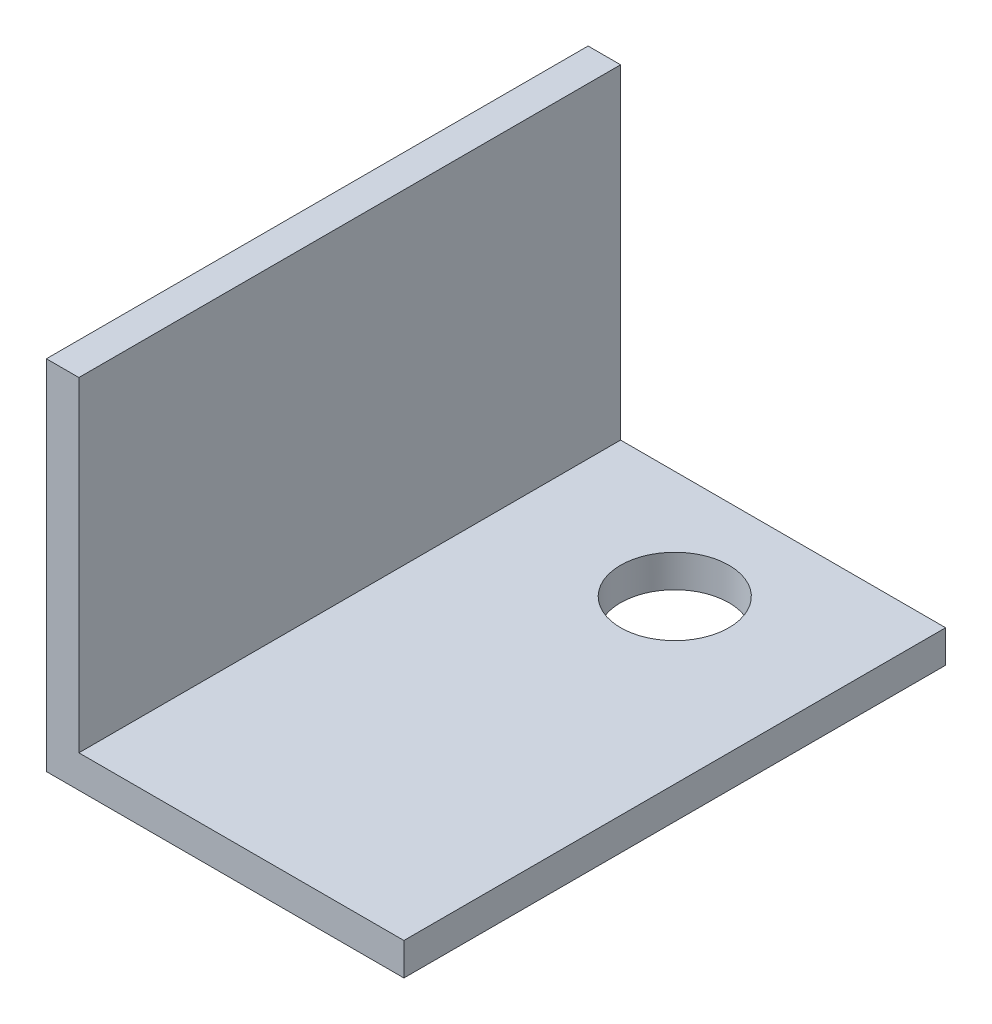
ISO-10303-21;
HEADER;
FILE_DESCRIPTION(('STEP AP214'),'2;1');
FILE_NAME('part.step','',(''),(''),'','','');
FILE_SCHEMA(('AUTOMOTIVE_DESIGN { 1 0 10303 214 1 1 1 1 }'));
ENDSEC;
DATA;
#1=APPLICATION_CONTEXT('core data for automotive mechanical design processes');
#2=APPLICATION_PROTOCOL_DEFINITION('international standard','automotive_design',2000,#1);
#3=PRODUCT_CONTEXT('',#1,'mechanical');
#4=PRODUCT('Part','Part','',(#3));
#5=PRODUCT_RELATED_PRODUCT_CATEGORY('part','',(#4));
#6=PRODUCT_DEFINITION_FORMATION('','',#4);
#7=PRODUCT_DEFINITION_CONTEXT('part definition',#1,'design');
#8=PRODUCT_DEFINITION('design','',#6,#7);
#9=PRODUCT_DEFINITION_SHAPE('','',#8);
#10=(LENGTH_UNIT() NAMED_UNIT(*) SI_UNIT(.MILLI.,.METRE.));
#11=(NAMED_UNIT(*) PLANE_ANGLE_UNIT() SI_UNIT($,.RADIAN.));
#12=(NAMED_UNIT(*) SI_UNIT($,.STERADIAN.) SOLID_ANGLE_UNIT());
#13=UNCERTAINTY_MEASURE_WITH_UNIT(LENGTH_MEASURE(1.E-05),#10,'distance_accuracy_value','');
#14=(GEOMETRIC_REPRESENTATION_CONTEXT(3) GLOBAL_UNCERTAINTY_ASSIGNED_CONTEXT((#13)) GLOBAL_UNIT_ASSIGNED_CONTEXT((#10,
#11,#12)) REPRESENTATION_CONTEXT('',''));
#15=CARTESIAN_POINT('',(0.,0.,0.));
#16=DIRECTION('',(0.,0.,1.));
#17=DIRECTION('',(1.,0.,0.));
#18=AXIS2_PLACEMENT_3D('',#15,#16,#17);
#19=CARTESIAN_POINT('',(0.,-3.,-50.));
#20=DIRECTION('',(0.,-1.,0.));
#21=DIRECTION('',(0.,0.,-1.));
#22=AXIS2_PLACEMENT_3D('',#19,#20,#21);
#23=PLANE('',#22);
#24=CARTESIAN_POINT('',(15.,-3.,-40.));
#25=DIRECTION('',(0.,1.,0.));
#26=DIRECTION('',(0.,0.,1.));
#27=AXIS2_PLACEMENT_3D('',#24,#25,#26);
#28=CIRCLE('',#27,5.);
#29=CARTESIAN_POINT('',(15.,-3.,-35.));
#30=VERTEX_POINT('',#29);
#31=EDGE_CURVE('E175',#30,#30,#28,.T.);
#32=ORIENTED_EDGE('',*,*,#31,.T.);
#33=EDGE_LOOP('',(#32));
#34=FACE_BOUND('',#33,.T.);
#35=DIRECTION('',(1.,0.,0.));
#36=VECTOR('',#35,1.);
#37=CARTESIAN_POINT('',(0.,-3.,0.));
#38=LINE('',#37,#36);
#39=CARTESIAN_POINT('',(-3.,-3.,0.));
#40=VERTEX_POINT('',#39);
#41=CARTESIAN_POINT('',(30.,-3.,0.));
#42=VERTEX_POINT('',#41);
#43=EDGE_CURVE('E116',#40,#42,#38,.T.);
#44=ORIENTED_EDGE('',*,*,#43,.F.);
#45=DIRECTION('',(0.,0.,1.));
#46=VECTOR('',#45,1.);
#47=CARTESIAN_POINT('',(-3.,-3.,-50.));
#48=LINE('',#47,#46);
#49=CARTESIAN_POINT('',(-3.,-3.,-50.));
#50=VERTEX_POINT('',#49);
#51=EDGE_CURVE('E11',#50,#40,#48,.T.);
#52=ORIENTED_EDGE('',*,*,#51,.F.);
#53=DIRECTION('',(1.,0.,0.));
#54=VECTOR('',#53,1.);
#55=CARTESIAN_POINT('',(0.,-3.,-50.));
#56=LINE('',#55,#54);
#57=CARTESIAN_POINT('',(30.,-3.,-50.));
#58=VERTEX_POINT('',#57);
#59=EDGE_CURVE('E129',#50,#58,#56,.T.);
#60=ORIENTED_EDGE('',*,*,#59,.T.);
#61=DIRECTION('',(0.,0.,1.));
#62=VECTOR('',#61,1.);
#63=CARTESIAN_POINT('',(30.,-3.,-50.));
#64=LINE('',#63,#62);
#65=EDGE_CURVE('E115',#58,#42,#64,.T.);
#66=ORIENTED_EDGE('',*,*,#65,.T.);
#67=EDGE_LOOP('',(#44,#52,#60,#66));
#68=FACE_BOUND('',#67,.T.);
#69=ADVANCED_FACE('F33',(#34,#68),#23,.T.);
#70=CARTESIAN_POINT('',(-3.,30.,-50.));
#71=DIRECTION('',(-1.,0.,0.));
#72=DIRECTION('',(0.,-1.,0.));
#73=AXIS2_PLACEMENT_3D('',#70,#71,#72);
#74=PLANE('',#73);
#75=DIRECTION('',(0.,-1.,0.));
#76=VECTOR('',#75,1.);
#77=CARTESIAN_POINT('',(-3.,30.,0.));
#78=LINE('',#77,#76);
#79=CARTESIAN_POINT('',(-3.,30.,0.));
#80=VERTEX_POINT('',#79);
#81=EDGE_CURVE('E127',#80,#40,#78,.T.);
#82=ORIENTED_EDGE('',*,*,#81,.F.);
#83=DIRECTION('',(0.,0.,1.));
#84=VECTOR('',#83,1.);
#85=CARTESIAN_POINT('',(-3.,30.,-50.));
#86=LINE('',#85,#84);
#87=CARTESIAN_POINT('',(-3.,30.,-50.));
#88=VERTEX_POINT('',#87);
#89=EDGE_CURVE('E42',#88,#80,#86,.T.);
#90=ORIENTED_EDGE('',*,*,#89,.F.);
#91=DIRECTION('',(0.,-1.,0.));
#92=VECTOR('',#91,1.);
#93=CARTESIAN_POINT('',(-3.,30.,-50.));
#94=LINE('',#93,#92);
#95=EDGE_CURVE('E96',#88,#50,#94,.T.);
#96=ORIENTED_EDGE('',*,*,#95,.T.);
#97=ORIENTED_EDGE('',*,*,#51,.T.);
#98=EDGE_LOOP('',(#82,#90,#96,#97));
#99=FACE_BOUND('',#98,.T.);
#100=ADVANCED_FACE('F142',(#99),#74,.T.);
#101=CARTESIAN_POINT('',(-3.,30.,-50.));
#102=DIRECTION('',(0.,-1.,0.));
#103=DIRECTION('',(0.,0.,-1.));
#104=AXIS2_PLACEMENT_3D('',#101,#102,#103);
#105=PLANE('',#104);
#106=DIRECTION('',(1.,0.,0.));
#107=VECTOR('',#106,1.);
#108=CARTESIAN_POINT('',(-3.,30.,0.));
#109=LINE('',#108,#107);
#110=CARTESIAN_POINT('',(0.,30.,0.));
#111=VERTEX_POINT('',#110);
#112=EDGE_CURVE('E101',#80,#111,#109,.T.);
#113=ORIENTED_EDGE('',*,*,#112,.T.);
#114=DIRECTION('',(0.,0.,1.));
#115=VECTOR('',#114,1.);
#116=CARTESIAN_POINT('',(0.,30.,-50.));
#117=LINE('',#116,#115);
#118=CARTESIAN_POINT('',(0.,30.,-50.));
#119=VERTEX_POINT('',#118);
#120=EDGE_CURVE('E99',#119,#111,#117,.T.);
#121=ORIENTED_EDGE('',*,*,#120,.F.);
#122=DIRECTION('',(1.,0.,0.));
#123=VECTOR('',#122,1.);
#124=CARTESIAN_POINT('',(-3.,30.,-50.));
#125=LINE('',#124,#123);
#126=EDGE_CURVE('E90',#88,#119,#125,.T.);
#127=ORIENTED_EDGE('',*,*,#126,.F.);
#128=ORIENTED_EDGE('',*,*,#89,.T.);
#129=EDGE_LOOP('',(#113,#121,#127,#128));
#130=FACE_BOUND('',#129,.T.);
#131=ADVANCED_FACE('F100',(#130),#105,.F.);
#132=CARTESIAN_POINT('',(0.,30.,-50.));
#133=DIRECTION('',(-1.,0.,0.));
#134=DIRECTION('',(0.,-1.,0.));
#135=AXIS2_PLACEMENT_3D('',#132,#133,#134);
#136=PLANE('',#135);
#137=DIRECTION('',(0.,-1.,0.));
#138=VECTOR('',#137,1.);
#139=CARTESIAN_POINT('',(0.,30.,0.));
#140=LINE('',#139,#138);
#141=CARTESIAN_POINT('',(0.,0.,0.));
#142=VERTEX_POINT('',#141);
#143=EDGE_CURVE('E124',#111,#142,#140,.T.);
#144=ORIENTED_EDGE('',*,*,#143,.T.);
#145=DIRECTION('',(0.,0.,1.));
#146=VECTOR('',#145,1.);
#147=CARTESIAN_POINT('',(0.,0.,-50.));
#148=LINE('',#147,#146);
#149=CARTESIAN_POINT('',(0.,0.,-50.));
#150=VERTEX_POINT('',#149);
#151=EDGE_CURVE('E104',#150,#142,#148,.T.);
#152=ORIENTED_EDGE('',*,*,#151,.F.);
#153=DIRECTION('',(0.,-1.,0.));
#154=VECTOR('',#153,1.);
#155=CARTESIAN_POINT('',(0.,30.,-50.));
#156=LINE('',#155,#154);
#157=EDGE_CURVE('E94',#119,#150,#156,.T.);
#158=ORIENTED_EDGE('',*,*,#157,.F.);
#159=ORIENTED_EDGE('',*,*,#120,.T.);
#160=EDGE_LOOP('',(#144,#152,#158,#159));
#161=FACE_BOUND('',#160,.T.);
#162=ADVANCED_FACE('F106',(#161),#136,.F.);
#163=CARTESIAN_POINT('',(0.,0.,-50.));
#164=DIRECTION('',(0.,-1.,0.));
#165=DIRECTION('',(0.,0.,-1.));
#166=AXIS2_PLACEMENT_3D('',#163,#164,#165);
#167=PLANE('',#166);
#168=CARTESIAN_POINT('',(15.,0.,-40.));
#169=DIRECTION('',(0.,-1.,0.));
#170=DIRECTION('',(0.,0.,-1.));
#171=AXIS2_PLACEMENT_3D('',#168,#169,#170);
#172=CIRCLE('',#171,5.);
#173=CARTESIAN_POINT('',(15.,0.,-45.));
#174=VERTEX_POINT('',#173);
#175=EDGE_CURVE('E36',#174,#174,#172,.F.);
#176=ORIENTED_EDGE('',*,*,#175,.F.);
#177=EDGE_LOOP('',(#176));
#178=FACE_BOUND('',#177,.T.);
#179=DIRECTION('',(1.,0.,0.));
#180=VECTOR('',#179,1.);
#181=CARTESIAN_POINT('',(0.,0.,0.));
#182=LINE('',#181,#180);
#183=CARTESIAN_POINT('',(30.,0.,0.));
#184=VERTEX_POINT('',#183);
#185=EDGE_CURVE('E122',#142,#184,#182,.T.);
#186=ORIENTED_EDGE('',*,*,#185,.T.);
#187=DIRECTION('',(0.,0.,1.));
#188=VECTOR('',#187,1.);
#189=CARTESIAN_POINT('',(30.,0.,-50.));
#190=LINE('',#189,#188);
#191=CARTESIAN_POINT('',(30.,0.,-50.));
#192=VERTEX_POINT('',#191);
#193=EDGE_CURVE('E133',#192,#184,#190,.T.);
#194=ORIENTED_EDGE('',*,*,#193,.F.);
#195=DIRECTION('',(1.,0.,0.));
#196=VECTOR('',#195,1.);
#197=CARTESIAN_POINT('',(0.,0.,-50.));
#198=LINE('',#197,#196);
#199=EDGE_CURVE('E109',#150,#192,#198,.T.);
#200=ORIENTED_EDGE('',*,*,#199,.F.);
#201=ORIENTED_EDGE('',*,*,#151,.T.);
#202=EDGE_LOOP('',(#186,#194,#200,#201));
#203=FACE_BOUND('',#202,.T.);
#204=ADVANCED_FACE('F156',(#178,#203),#167,.F.);
#205=CARTESIAN_POINT('',(30.,0.,-50.));
#206=DIRECTION('',(-1.,0.,0.));
#207=DIRECTION('',(0.,0.,1.));
#208=AXIS2_PLACEMENT_3D('',#205,#206,#207);
#209=PLANE('',#208);
#210=DIRECTION('',(0.,-1.,0.));
#211=VECTOR('',#210,1.);
#212=CARTESIAN_POINT('',(30.,0.,0.));
#213=LINE('',#212,#211);
#214=EDGE_CURVE('E119',#184,#42,#213,.T.);
#215=ORIENTED_EDGE('',*,*,#214,.T.);
#216=ORIENTED_EDGE('',*,*,#65,.F.);
#217=DIRECTION('',(0.,-1.,0.));
#218=VECTOR('',#217,1.);
#219=CARTESIAN_POINT('',(30.,0.,-50.));
#220=LINE('',#219,#218);
#221=EDGE_CURVE('E82',#192,#58,#220,.T.);
#222=ORIENTED_EDGE('',*,*,#221,.F.);
#223=ORIENTED_EDGE('',*,*,#193,.T.);
#224=EDGE_LOOP('',(#215,#216,#222,#223));
#225=FACE_BOUND('',#224,.T.);
#226=ADVANCED_FACE('F137',(#225),#209,.F.);
#227=CARTESIAN_POINT('',(0.,0.,-50.));
#228=DIRECTION('',(0.,0.,-1.));
#229=DIRECTION('',(-1.,0.,0.));
#230=AXIS2_PLACEMENT_3D('',#227,#228,#229);
#231=PLANE('',#230);
#232=ORIENTED_EDGE('',*,*,#59,.F.);
#233=ORIENTED_EDGE('',*,*,#95,.F.);
#234=ORIENTED_EDGE('',*,*,#126,.T.);
#235=ORIENTED_EDGE('',*,*,#157,.T.);
#236=ORIENTED_EDGE('',*,*,#199,.T.);
#237=ORIENTED_EDGE('',*,*,#221,.T.);
#238=EDGE_LOOP('',(#232,#233,#234,#235,#236,#237));
#239=FACE_BOUND('',#238,.T.);
#240=ADVANCED_FACE('F92',(#239),#231,.T.);
#241=CARTESIAN_POINT('',(0.,0.,0.));
#242=DIRECTION('',(0.,0.,-1.));
#243=DIRECTION('',(-1.,0.,0.));
#244=AXIS2_PLACEMENT_3D('',#241,#242,#243);
#245=PLANE('',#244);
#246=ORIENTED_EDGE('',*,*,#43,.T.);
#247=ORIENTED_EDGE('',*,*,#214,.F.);
#248=ORIENTED_EDGE('',*,*,#185,.F.);
#249=ORIENTED_EDGE('',*,*,#143,.F.);
#250=ORIENTED_EDGE('',*,*,#112,.F.);
#251=ORIENTED_EDGE('',*,*,#81,.T.);
#252=EDGE_LOOP('',(#246,#247,#248,#249,#250,#251));
#253=FACE_BOUND('',#252,.T.);
#254=ADVANCED_FACE('F141',(#253),#245,.F.);
#255=CARTESIAN_POINT('',(15.,7.,-40.));
#256=DIRECTION('',(0.,-1.,0.));
#257=DIRECTION('',(0.,0.,-1.));
#258=AXIS2_PLACEMENT_3D('',#255,#256,#257);
#259=CYLINDRICAL_SURFACE('',#258,5.);
#260=ORIENTED_EDGE('',*,*,#31,.F.);
#261=EDGE_LOOP('',(#260));
#262=FACE_BOUND('',#261,.T.);
#263=ORIENTED_EDGE('',*,*,#175,.T.);
#264=EDGE_LOOP('',(#263));
#265=FACE_BOUND('',#264,.T.);
#266=ADVANCED_FACE('F166',(#262,#265),#259,.F.);
#267=CLOSED_SHELL('',(#69,#100,#131,#162,#204,#226,#240,#254,#266));
#268=MANIFOLD_SOLID_BREP('B2',#267);
#269=ADVANCED_BREP_SHAPE_REPRESENTATION('',(#18,#268),#14);
#270=SHAPE_DEFINITION_REPRESENTATION(#9,#269);
ENDSEC;
END-ISO-10303-21;
